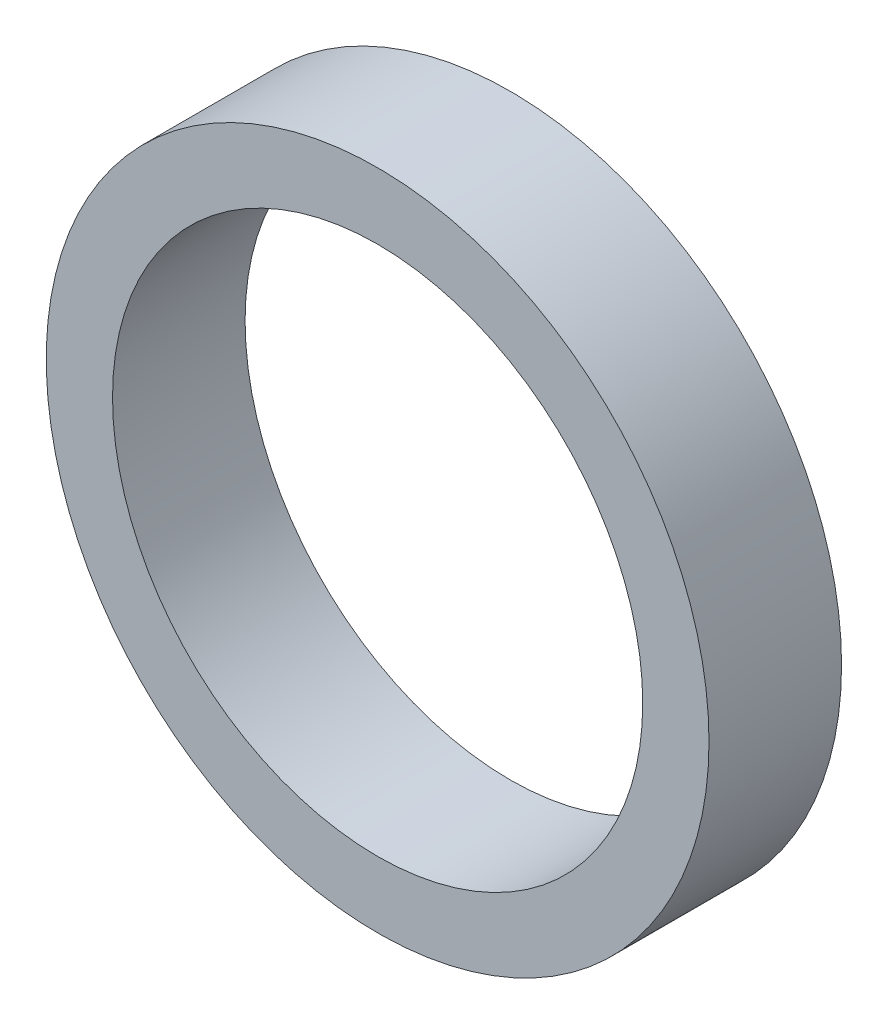
ISO-10303-21;
HEADER;
FILE_DESCRIPTION(('STEP AP214'),'2;1');
FILE_NAME('part.step','',(''),(''),'','','');
FILE_SCHEMA(('AUTOMOTIVE_DESIGN { 1 0 10303 214 1 1 1 1 }'));
ENDSEC;
DATA;
#1=APPLICATION_CONTEXT('core data for automotive mechanical design processes');
#2=APPLICATION_PROTOCOL_DEFINITION('international standard','automotive_design',2000,#1);
#3=PRODUCT_CONTEXT('',#1,'mechanical');
#4=PRODUCT('Part','Part','',(#3));
#5=PRODUCT_RELATED_PRODUCT_CATEGORY('part','',(#4));
#6=PRODUCT_DEFINITION_FORMATION('','',#4);
#7=PRODUCT_DEFINITION_CONTEXT('part definition',#1,'design');
#8=PRODUCT_DEFINITION('design','',#6,#7);
#9=PRODUCT_DEFINITION_SHAPE('','',#8);
#10=(LENGTH_UNIT() NAMED_UNIT(*) SI_UNIT(.MILLI.,.METRE.));
#11=(NAMED_UNIT(*) PLANE_ANGLE_UNIT() SI_UNIT($,.RADIAN.));
#12=(NAMED_UNIT(*) SI_UNIT($,.STERADIAN.) SOLID_ANGLE_UNIT());
#13=UNCERTAINTY_MEASURE_WITH_UNIT(LENGTH_MEASURE(1.E-05),#10,'distance_accuracy_value','');
#14=(GEOMETRIC_REPRESENTATION_CONTEXT(3) GLOBAL_UNCERTAINTY_ASSIGNED_CONTEXT((#13)) GLOBAL_UNIT_ASSIGNED_CONTEXT((#10,
#11,#12)) REPRESENTATION_CONTEXT('',''));
#15=CARTESIAN_POINT('',(0.,0.,0.));
#16=DIRECTION('',(0.,0.,1.));
#17=DIRECTION('',(1.,0.,0.));
#18=AXIS2_PLACEMENT_3D('',#15,#16,#17);
#19=CARTESIAN_POINT('',(0.,0.,12.7));
#20=DIRECTION('',(0.,0.,1.));
#21=DIRECTION('',(1.,0.,0.));
#22=AXIS2_PLACEMENT_3D('',#19,#20,#21);
#23=PLANE('',#22);
#24=CARTESIAN_POINT('',(0.,0.,12.7));
#25=DIRECTION('',(0.,0.,1.));
#26=DIRECTION('',(1.,0.,0.));
#27=AXIS2_PLACEMENT_3D('',#24,#25,#26);
#28=CIRCLE('',#27,31.75);
#29=CARTESIAN_POINT('',(31.75,0.,12.7));
#30=VERTEX_POINT('',#29);
#31=EDGE_CURVE('E10',#30,#30,#28,.T.);
#32=ORIENTED_EDGE('',*,*,#31,.T.);
#33=EDGE_LOOP('',(#32));
#34=FACE_BOUND('',#33,.T.);
#35=CARTESIAN_POINT('',(0.,0.,12.7));
#36=DIRECTION('',(0.,0.,1.));
#37=DIRECTION('',(1.,0.,0.));
#38=AXIS2_PLACEMENT_3D('',#35,#36,#37);
#39=CIRCLE('',#38,25.4);
#40=CARTESIAN_POINT('',(25.4,0.,12.7));
#41=VERTEX_POINT('',#40);
#42=EDGE_CURVE('E50',#41,#41,#39,.T.);
#43=ORIENTED_EDGE('',*,*,#42,.F.);
#44=EDGE_LOOP('',(#43));
#45=FACE_BOUND('',#44,.T.);
#46=ADVANCED_FACE('F39',(#34,#45),#23,.T.);
#47=CARTESIAN_POINT('',(0.,0.,0.));
#48=DIRECTION('',(0.,0.,1.));
#49=DIRECTION('',(1.,0.,0.));
#50=AXIS2_PLACEMENT_3D('',#47,#48,#49);
#51=PLANE('',#50);
#52=CARTESIAN_POINT('',(0.,0.,0.));
#53=DIRECTION('',(0.,0.,1.));
#54=DIRECTION('',(1.,0.,0.));
#55=AXIS2_PLACEMENT_3D('',#52,#53,#54);
#56=CIRCLE('',#55,31.75);
#57=CARTESIAN_POINT('',(31.75,0.,0.));
#58=VERTEX_POINT('',#57);
#59=EDGE_CURVE('E43',#58,#58,#56,.T.);
#60=ORIENTED_EDGE('',*,*,#59,.F.);
#61=EDGE_LOOP('',(#60));
#62=FACE_BOUND('',#61,.T.);
#63=CARTESIAN_POINT('',(0.,0.,0.));
#64=DIRECTION('',(0.,0.,1.));
#65=DIRECTION('',(1.,0.,0.));
#66=AXIS2_PLACEMENT_3D('',#63,#64,#65);
#67=CIRCLE('',#66,25.4);
#68=CARTESIAN_POINT('',(25.4,0.,0.));
#69=VERTEX_POINT('',#68);
#70=EDGE_CURVE('E52',#69,#69,#67,.T.);
#71=ORIENTED_EDGE('',*,*,#70,.T.);
#72=EDGE_LOOP('',(#71));
#73=FACE_BOUND('',#72,.T.);
#74=ADVANCED_FACE('F62',(#62,#73),#51,.F.);
#75=CARTESIAN_POINT('',(0.,0.,12.7));
#76=DIRECTION('',(0.,0.,-1.));
#77=DIRECTION('',(-1.,0.,0.));
#78=AXIS2_PLACEMENT_3D('',#75,#76,#77);
#79=CYLINDRICAL_SURFACE('',#78,31.75);
#80=ORIENTED_EDGE('',*,*,#31,.F.);
#81=EDGE_LOOP('',(#80));
#82=FACE_BOUND('',#81,.T.);
#83=ORIENTED_EDGE('',*,*,#59,.T.);
#84=EDGE_LOOP('',(#83));
#85=FACE_BOUND('',#84,.T.);
#86=ADVANCED_FACE('F41',(#82,#85),#79,.T.);
#87=CARTESIAN_POINT('',(0.,0.,12.7));
#88=DIRECTION('',(0.,0.,-1.));
#89=DIRECTION('',(-1.,0.,0.));
#90=AXIS2_PLACEMENT_3D('',#87,#88,#89);
#91=CYLINDRICAL_SURFACE('',#90,25.4);
#92=ORIENTED_EDGE('',*,*,#42,.T.);
#93=EDGE_LOOP('',(#92));
#94=FACE_BOUND('',#93,.T.);
#95=ORIENTED_EDGE('',*,*,#70,.F.);
#96=EDGE_LOOP('',(#95));
#97=FACE_BOUND('',#96,.T.);
#98=ADVANCED_FACE('F58',(#94,#97),#91,.F.);
#99=CLOSED_SHELL('',(#46,#74,#86,#98));
#100=MANIFOLD_SOLID_BREP('B2',#99);
#101=ADVANCED_BREP_SHAPE_REPRESENTATION('',(#18,#100),#14);
#102=SHAPE_DEFINITION_REPRESENTATION(#9,#101);
ENDSEC;
END-ISO-10303-21;
